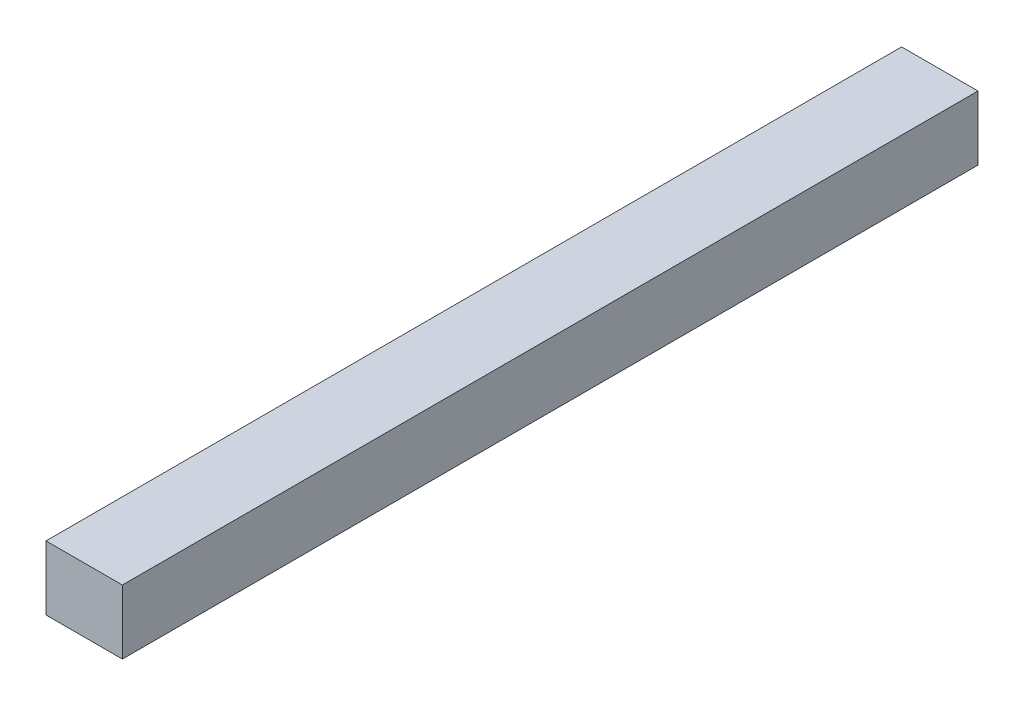
ISO-10303-21;
HEADER;
FILE_DESCRIPTION(('STEP AP214'),'2;1');
FILE_NAME('part.step','',(''),(''),'','','');
FILE_SCHEMA(('AUTOMOTIVE_DESIGN { 1 0 10303 214 1 1 1 1 }'));
ENDSEC;
DATA;
#1=APPLICATION_CONTEXT('core data for automotive mechanical design processes');
#2=APPLICATION_PROTOCOL_DEFINITION('international standard','automotive_design',2000,#1);
#3=PRODUCT_CONTEXT('',#1,'mechanical');
#4=PRODUCT('Part','Part','',(#3));
#5=PRODUCT_RELATED_PRODUCT_CATEGORY('part','',(#4));
#6=PRODUCT_DEFINITION_FORMATION('','',#4);
#7=PRODUCT_DEFINITION_CONTEXT('part definition',#1,'design');
#8=PRODUCT_DEFINITION('design','',#6,#7);
#9=PRODUCT_DEFINITION_SHAPE('','',#8);
#10=(LENGTH_UNIT() NAMED_UNIT(*) SI_UNIT(.MILLI.,.METRE.));
#11=(NAMED_UNIT(*) PLANE_ANGLE_UNIT() SI_UNIT($,.RADIAN.));
#12=(NAMED_UNIT(*) SI_UNIT($,.STERADIAN.) SOLID_ANGLE_UNIT());
#13=UNCERTAINTY_MEASURE_WITH_UNIT(LENGTH_MEASURE(1.E-05),#10,'distance_accuracy_value','');
#14=(GEOMETRIC_REPRESENTATION_CONTEXT(3) GLOBAL_UNCERTAINTY_ASSIGNED_CONTEXT((#13)) GLOBAL_UNIT_ASSIGNED_CONTEXT((#10,
#11,#12)) REPRESENTATION_CONTEXT('',''));
#15=CARTESIAN_POINT('',(0.,0.,0.));
#16=DIRECTION('',(0.,0.,1.));
#17=DIRECTION('',(1.,0.,0.));
#18=AXIS2_PLACEMENT_3D('',#15,#16,#17);
#19=CARTESIAN_POINT('',(0.,0.,840.));
#20=DIRECTION('',(1.,0.,0.));
#21=DIRECTION('',(0.,0.,-1.));
#22=AXIS2_PLACEMENT_3D('',#19,#20,#21);
#23=PLANE('',#22);
#24=DIRECTION('',(0.,-1.,0.));
#25=VECTOR('',#24,1.);
#26=CARTESIAN_POINT('',(0.,0.,0.));
#27=LINE('',#26,#25);
#28=CARTESIAN_POINT('',(0.,63.,0.));
#29=VERTEX_POINT('',#28);
#30=CARTESIAN_POINT('',(0.,0.,0.));
#31=VERTEX_POINT('',#30);
#32=EDGE_CURVE('E95',#29,#31,#27,.T.);
#33=ORIENTED_EDGE('',*,*,#32,.T.);
#34=DIRECTION('',(0.,0.,-1.));
#35=VECTOR('',#34,1.);
#36=CARTESIAN_POINT('',(0.,0.,840.));
#37=LINE('',#36,#35);
#38=CARTESIAN_POINT('',(0.,0.,840.));
#39=VERTEX_POINT('',#38);
#40=EDGE_CURVE('E11',#39,#31,#37,.T.);
#41=ORIENTED_EDGE('',*,*,#40,.F.);
#42=DIRECTION('',(0.,-1.,0.));
#43=VECTOR('',#42,1.);
#44=CARTESIAN_POINT('',(0.,0.,840.));
#45=LINE('',#44,#43);
#46=CARTESIAN_POINT('',(0.,63.,840.));
#47=VERTEX_POINT('',#46);
#48=EDGE_CURVE('E83',#47,#39,#45,.T.);
#49=ORIENTED_EDGE('',*,*,#48,.F.);
#50=DIRECTION('',(0.,0.,-1.));
#51=VECTOR('',#50,1.);
#52=CARTESIAN_POINT('',(0.,63.,840.));
#53=LINE('',#52,#51);
#54=EDGE_CURVE('E91',#47,#29,#53,.T.);
#55=ORIENTED_EDGE('',*,*,#54,.T.);
#56=EDGE_LOOP('',(#33,#41,#49,#55));
#57=FACE_BOUND('',#56,.T.);
#58=ADVANCED_FACE('F32',(#57),#23,.F.);
#59=CARTESIAN_POINT('',(0.,0.,840.));
#60=DIRECTION('',(0.,1.,0.));
#61=DIRECTION('',(0.,0.,1.));
#62=AXIS2_PLACEMENT_3D('',#59,#60,#61);
#63=PLANE('',#62);
#64=DIRECTION('',(1.,0.,0.));
#65=VECTOR('',#64,1.);
#66=CARTESIAN_POINT('',(0.,0.,0.));
#67=LINE('',#66,#65);
#68=CARTESIAN_POINT('',(75.,0.,0.));
#69=VERTEX_POINT('',#68);
#70=EDGE_CURVE('E87',#31,#69,#67,.T.);
#71=ORIENTED_EDGE('',*,*,#70,.T.);
#72=DIRECTION('',(0.,0.,-1.));
#73=VECTOR('',#72,1.);
#74=CARTESIAN_POINT('',(75.,0.,840.));
#75=LINE('',#74,#73);
#76=CARTESIAN_POINT('',(75.,0.,840.));
#77=VERTEX_POINT('',#76);
#78=EDGE_CURVE('E40',#77,#69,#75,.T.);
#79=ORIENTED_EDGE('',*,*,#78,.F.);
#80=DIRECTION('',(1.,0.,0.));
#81=VECTOR('',#80,1.);
#82=CARTESIAN_POINT('',(0.,0.,840.));
#83=LINE('',#82,#81);
#84=EDGE_CURVE('E78',#39,#77,#83,.T.);
#85=ORIENTED_EDGE('',*,*,#84,.F.);
#86=ORIENTED_EDGE('',*,*,#40,.T.);
#87=EDGE_LOOP('',(#71,#79,#85,#86));
#88=FACE_BOUND('',#87,.T.);
#89=ADVANCED_FACE('F86',(#88),#63,.F.);
#90=CARTESIAN_POINT('',(75.,0.,840.));
#91=DIRECTION('',(-1.,0.,0.));
#92=DIRECTION('',(0.,0.,1.));
#93=AXIS2_PLACEMENT_3D('',#90,#91,#92);
#94=PLANE('',#93);
#95=DIRECTION('',(0.,1.,0.));
#96=VECTOR('',#95,1.);
#97=CARTESIAN_POINT('',(75.,0.,0.));
#98=LINE('',#97,#96);
#99=CARTESIAN_POINT('',(75.,63.,0.));
#100=VERTEX_POINT('',#99);
#101=EDGE_CURVE('E65',#69,#100,#98,.T.);
#102=ORIENTED_EDGE('',*,*,#101,.T.);
#103=DIRECTION('',(0.,0.,-1.));
#104=VECTOR('',#103,1.);
#105=CARTESIAN_POINT('',(75.,63.,840.));
#106=LINE('',#105,#104);
#107=CARTESIAN_POINT('',(75.,63.,840.));
#108=VERTEX_POINT('',#107);
#109=EDGE_CURVE('E88',#108,#100,#106,.T.);
#110=ORIENTED_EDGE('',*,*,#109,.F.);
#111=DIRECTION('',(0.,1.,0.));
#112=VECTOR('',#111,1.);
#113=CARTESIAN_POINT('',(75.,0.,840.));
#114=LINE('',#113,#112);
#115=EDGE_CURVE('E81',#77,#108,#114,.T.);
#116=ORIENTED_EDGE('',*,*,#115,.F.);
#117=ORIENTED_EDGE('',*,*,#78,.T.);
#118=EDGE_LOOP('',(#102,#110,#116,#117));
#119=FACE_BOUND('',#118,.T.);
#120=ADVANCED_FACE('F89',(#119),#94,.F.);
#121=CARTESIAN_POINT('',(0.,63.,840.));
#122=DIRECTION('',(0.,-1.,0.));
#123=DIRECTION('',(0.,0.,-1.));
#124=AXIS2_PLACEMENT_3D('',#121,#122,#123);
#125=PLANE('',#124);
#126=DIRECTION('',(-1.,0.,0.));
#127=VECTOR('',#126,1.);
#128=CARTESIAN_POINT('',(0.,63.,0.));
#129=LINE('',#128,#127);
#130=EDGE_CURVE('E71',#100,#29,#129,.T.);
#131=ORIENTED_EDGE('',*,*,#130,.T.);
#132=ORIENTED_EDGE('',*,*,#54,.F.);
#133=DIRECTION('',(-1.,0.,0.));
#134=VECTOR('',#133,1.);
#135=CARTESIAN_POINT('',(0.,63.,840.));
#136=LINE('',#135,#134);
#137=EDGE_CURVE('E48',#108,#47,#136,.T.);
#138=ORIENTED_EDGE('',*,*,#137,.F.);
#139=ORIENTED_EDGE('',*,*,#109,.T.);
#140=EDGE_LOOP('',(#131,#132,#138,#139));
#141=FACE_BOUND('',#140,.T.);
#142=ADVANCED_FACE('F102',(#141),#125,.F.);
#143=CARTESIAN_POINT('',(0.,0.,840.));
#144=DIRECTION('',(0.,0.,-1.));
#145=DIRECTION('',(-1.,0.,0.));
#146=AXIS2_PLACEMENT_3D('',#143,#144,#145);
#147=PLANE('',#146);
#148=ORIENTED_EDGE('',*,*,#48,.T.);
#149=ORIENTED_EDGE('',*,*,#84,.T.);
#150=ORIENTED_EDGE('',*,*,#115,.T.);
#151=ORIENTED_EDGE('',*,*,#137,.T.);
#152=EDGE_LOOP('',(#148,#149,#150,#151));
#153=FACE_BOUND('',#152,.T.);
#154=ADVANCED_FACE('F79',(#153),#147,.F.);
#155=CARTESIAN_POINT('',(0.,0.,0.));
#156=DIRECTION('',(0.,0.,-1.));
#157=DIRECTION('',(-1.,0.,0.));
#158=AXIS2_PLACEMENT_3D('',#155,#156,#157);
#159=PLANE('',#158);
#160=ORIENTED_EDGE('',*,*,#32,.F.);
#161=ORIENTED_EDGE('',*,*,#130,.F.);
#162=ORIENTED_EDGE('',*,*,#101,.F.);
#163=ORIENTED_EDGE('',*,*,#70,.F.);
#164=EDGE_LOOP('',(#160,#161,#162,#163));
#165=FACE_BOUND('',#164,.T.);
#166=ADVANCED_FACE('F105',(#165),#159,.T.);
#167=CLOSED_SHELL('',(#58,#89,#120,#142,#154,#166));
#168=MANIFOLD_SOLID_BREP('B2',#167);
#169=ADVANCED_BREP_SHAPE_REPRESENTATION('',(#18,#168),#14);
#170=SHAPE_DEFINITION_REPRESENTATION(#9,#169);
ENDSEC;
END-ISO-10303-21;
